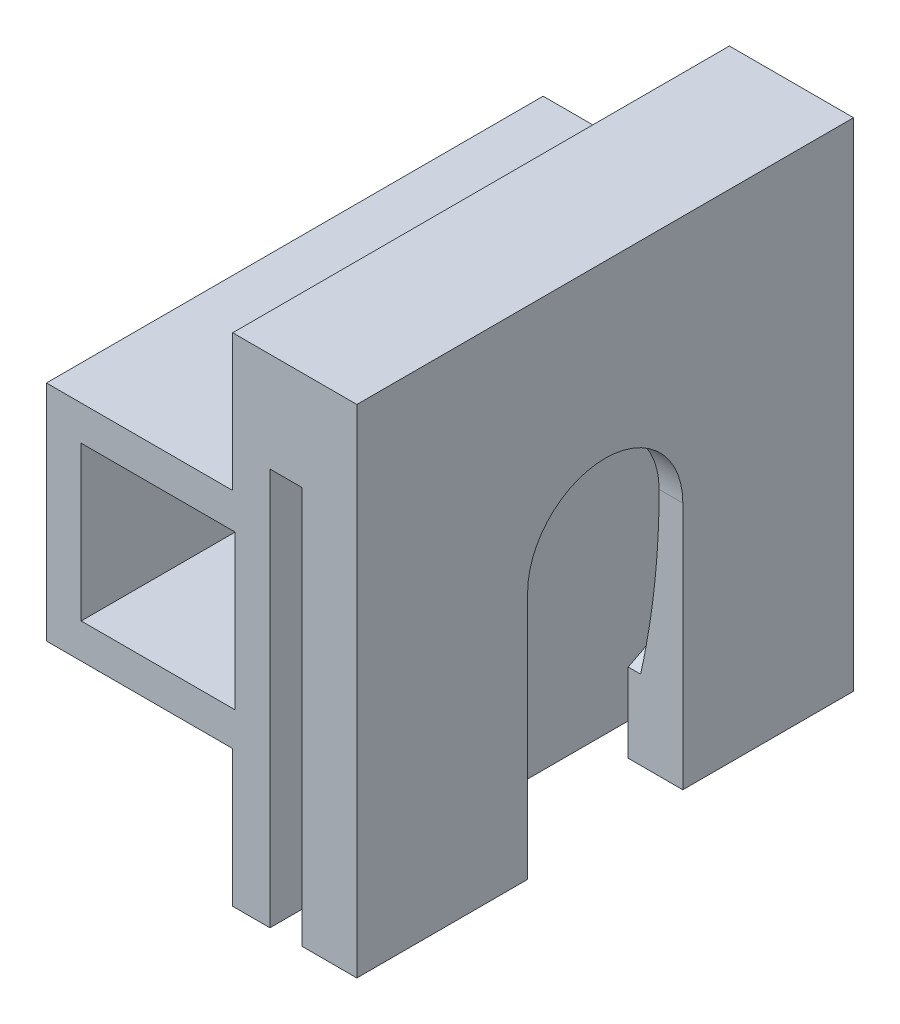
ISO-10303-21;
HEADER;
FILE_DESCRIPTION(('STEP AP214'),'2;1');
FILE_NAME('part.step','',(''),(''),'','','');
FILE_SCHEMA(('AUTOMOTIVE_DESIGN { 1 0 10303 214 1 1 1 1 }'));
ENDSEC;
DATA;
#1=APPLICATION_CONTEXT('core data for automotive mechanical design processes');
#2=APPLICATION_PROTOCOL_DEFINITION('international standard','automotive_design',2000,#1);
#3=PRODUCT_CONTEXT('',#1,'mechanical');
#4=PRODUCT('Part','Part','',(#3));
#5=PRODUCT_RELATED_PRODUCT_CATEGORY('part','',(#4));
#6=PRODUCT_DEFINITION_FORMATION('','',#4);
#7=PRODUCT_DEFINITION_CONTEXT('part definition',#1,'design');
#8=PRODUCT_DEFINITION('design','',#6,#7);
#9=PRODUCT_DEFINITION_SHAPE('','',#8);
#10=(LENGTH_UNIT() NAMED_UNIT(*) SI_UNIT(.MILLI.,.METRE.));
#11=(NAMED_UNIT(*) PLANE_ANGLE_UNIT() SI_UNIT($,.RADIAN.));
#12=(NAMED_UNIT(*) SI_UNIT($,.STERADIAN.) SOLID_ANGLE_UNIT());
#13=UNCERTAINTY_MEASURE_WITH_UNIT(LENGTH_MEASURE(1.E-05),#10,'distance_accuracy_value','');
#14=(GEOMETRIC_REPRESENTATION_CONTEXT(3) GLOBAL_UNCERTAINTY_ASSIGNED_CONTEXT((#13)) GLOBAL_UNIT_ASSIGNED_CONTEXT((#10,
#11,#12)) REPRESENTATION_CONTEXT('',''));
#15=CARTESIAN_POINT('',(0.,0.,0.));
#16=DIRECTION('',(0.,0.,1.));
#17=DIRECTION('',(1.,0.,0.));
#18=AXIS2_PLACEMENT_3D('',#15,#16,#17);
#19=CARTESIAN_POINT('',(-25.2842712474619,-10.,20.));
#20=DIRECTION('',(0.,-1.,0.));
#21=DIRECTION('',(0.,0.,-1.));
#22=AXIS2_PLACEMENT_3D('',#19,#20,#21);
#23=PLANE('',#22);
#24=DIRECTION('',(1.,0.,0.));
#25=VECTOR('',#24,1.);
#26=CARTESIAN_POINT('',(-11.1104853464801,-10.,6.875));
#27=LINE('',#26,#25);
#28=CARTESIAN_POINT('',(5.8,-10.,6.875));
#29=VERTEX_POINT('',#28);
#30=CARTESIAN_POINT('',(8.,-10.,6.875));
#31=VERTEX_POINT('',#30);
#32=EDGE_CURVE('E273',#29,#31,#27,.T.);
#33=ORIENTED_EDGE('',*,*,#32,.F.);
#34=DIRECTION('',(0.,0.,1.));
#35=VECTOR('',#34,1.);
#36=CARTESIAN_POINT('',(5.8,-10.,0.));
#37=LINE('',#36,#35);
#38=CARTESIAN_POINT('',(5.8,-10.,0.));
#39=VERTEX_POINT('',#38);
#40=EDGE_CURVE('E233',#39,#29,#37,.T.);
#41=ORIENTED_EDGE('',*,*,#40,.F.);
#42=DIRECTION('',(1.,0.,0.));
#43=VECTOR('',#42,1.);
#44=CARTESIAN_POINT('',(-25.2842712474619,-10.,0.));
#45=LINE('',#44,#43);
#46=CARTESIAN_POINT('',(8.,-10.,0.));
#47=VERTEX_POINT('',#46);
#48=EDGE_CURVE('E336',#39,#47,#45,.T.);
#49=ORIENTED_EDGE('',*,*,#48,.T.);
#50=DIRECTION('',(0.,0.,-1.));
#51=VECTOR('',#50,1.);
#52=CARTESIAN_POINT('',(8.,-10.,20.));
#53=LINE('',#52,#51);
#54=EDGE_CURVE('E304',#31,#47,#53,.T.);
#55=ORIENTED_EDGE('',*,*,#54,.F.);
#56=EDGE_LOOP('',(#33,#41,#49,#55));
#57=FACE_BOUND('',#56,.T.);
#58=ADVANCED_FACE('F33',(#57),#23,.T.);
#59=DIRECTION('',(0.,0.,-1.));
#60=VECTOR('',#59,1.);
#61=CARTESIAN_POINT('',(4.5,-10.,20.));
#62=LINE('',#61,#60);
#63=CARTESIAN_POINT('',(4.5,-10.,20.));
#64=VERTEX_POINT('',#63);
#65=CARTESIAN_POINT('',(4.50000000000001,-10.,0.));
#66=VERTEX_POINT('',#65);
#67=EDGE_CURVE('E272',#64,#66,#62,.T.);
#68=ORIENTED_EDGE('',*,*,#67,.F.);
#69=DIRECTION('',(1.,0.,0.));
#70=VECTOR('',#69,1.);
#71=CARTESIAN_POINT('',(-25.2842712474619,-10.,20.));
#72=LINE('',#71,#70);
#73=CARTESIAN_POINT('',(3.,-10.,20.));
#74=VERTEX_POINT('',#73);
#75=EDGE_CURVE('E337',#74,#64,#72,.T.);
#76=ORIENTED_EDGE('',*,*,#75,.F.);
#77=DIRECTION('',(0.,0.,1.));
#78=VECTOR('',#77,1.);
#79=CARTESIAN_POINT('',(3.,-10.,20.));
#80=LINE('',#79,#78);
#81=CARTESIAN_POINT('',(3.,-10.,0.));
#82=VERTEX_POINT('',#81);
#83=EDGE_CURVE('E328',#82,#74,#80,.T.);
#84=ORIENTED_EDGE('',*,*,#83,.F.);
#85=EDGE_CURVE('E333',#82,#66,#45,.T.);
#86=ORIENTED_EDGE('',*,*,#85,.T.);
#87=EDGE_LOOP('',(#68,#76,#84,#86));
#88=FACE_BOUND('',#87,.T.);
#89=ADVANCED_FACE('F456',(#88),#23,.T.);
#90=CARTESIAN_POINT('',(4.5,-4.5,20.));
#91=DIRECTION('',(0.,1.,0.));
#92=DIRECTION('',(0.,0.,1.));
#93=AXIS2_PLACEMENT_3D('',#90,#91,#92);
#94=PLANE('',#93);
#95=DIRECTION('',(0.,0.,-1.));
#96=VECTOR('',#95,1.);
#97=CARTESIAN_POINT('',(3.,-4.5,20.));
#98=LINE('',#97,#96);
#99=CARTESIAN_POINT('',(3.,-4.5,20.));
#100=VERTEX_POINT('',#99);
#101=CARTESIAN_POINT('',(3.,-4.5,0.));
#102=VERTEX_POINT('',#101);
#103=EDGE_CURVE('E344',#100,#102,#98,.T.);
#104=ORIENTED_EDGE('',*,*,#103,.F.);
#105=DIRECTION('',(1.,0.,0.));
#106=VECTOR('',#105,1.);
#107=CARTESIAN_POINT('',(4.5,-4.5,20.));
#108=LINE('',#107,#106);
#109=CARTESIAN_POINT('',(-4.5,-4.5,20.));
#110=VERTEX_POINT('',#109);
#111=EDGE_CURVE('E351',#110,#100,#108,.T.);
#112=ORIENTED_EDGE('',*,*,#111,.F.);
#113=DIRECTION('',(0.,0.,-1.));
#114=VECTOR('',#113,1.);
#115=CARTESIAN_POINT('',(-4.5,-4.5,20.));
#116=LINE('',#115,#114);
#117=CARTESIAN_POINT('',(-4.5,-4.5,0.));
#118=VERTEX_POINT('',#117);
#119=EDGE_CURVE('E365',#110,#118,#116,.T.);
#120=ORIENTED_EDGE('',*,*,#119,.T.);
#121=DIRECTION('',(1.,0.,0.));
#122=VECTOR('',#121,1.);
#123=CARTESIAN_POINT('',(4.5,-4.5,0.));
#124=LINE('',#123,#122);
#125=EDGE_CURVE('E360',#118,#102,#124,.T.);
#126=ORIENTED_EDGE('',*,*,#125,.T.);
#127=EDGE_LOOP('',(#104,#112,#120,#126));
#128=FACE_BOUND('',#127,.T.);
#129=ADVANCED_FACE('F458',(#128),#94,.F.);
#130=CARTESIAN_POINT('',(4.5,4.5,20.));
#131=DIRECTION('',(0.,-1.,0.));
#132=DIRECTION('',(1.,0.,0.));
#133=AXIS2_PLACEMENT_3D('',#130,#131,#132);
#134=PLANE('',#133);
#135=DIRECTION('',(0.,0.,1.));
#136=VECTOR('',#135,1.);
#137=CARTESIAN_POINT('',(3.,4.5,20.));
#138=LINE('',#137,#136);
#139=CARTESIAN_POINT('',(3.,4.5,0.));
#140=VERTEX_POINT('',#139);
#141=CARTESIAN_POINT('',(3.,4.5,20.));
#142=VERTEX_POINT('',#141);
#143=EDGE_CURVE('E341',#140,#142,#138,.T.);
#144=ORIENTED_EDGE('',*,*,#143,.F.);
#145=DIRECTION('',(-1.,0.,0.));
#146=VECTOR('',#145,1.);
#147=CARTESIAN_POINT('',(4.5,4.5,0.));
#148=LINE('',#147,#146);
#149=CARTESIAN_POINT('',(-4.5,4.5,0.));
#150=VERTEX_POINT('',#149);
#151=EDGE_CURVE('E352',#140,#150,#148,.T.);
#152=ORIENTED_EDGE('',*,*,#151,.T.);
#153=DIRECTION('',(0.,0.,-1.));
#154=VECTOR('',#153,1.);
#155=CARTESIAN_POINT('',(-4.5,4.5,20.));
#156=LINE('',#155,#154);
#157=CARTESIAN_POINT('',(-4.5,4.5,20.));
#158=VERTEX_POINT('',#157);
#159=EDGE_CURVE('E357',#158,#150,#156,.T.);
#160=ORIENTED_EDGE('',*,*,#159,.F.);
#161=DIRECTION('',(-1.,0.,0.));
#162=VECTOR('',#161,1.);
#163=CARTESIAN_POINT('',(4.5,4.5,20.));
#164=LINE('',#163,#162);
#165=EDGE_CURVE('E355',#142,#158,#164,.T.);
#166=ORIENTED_EDGE('',*,*,#165,.F.);
#167=EDGE_LOOP('',(#144,#152,#160,#166));
#168=FACE_BOUND('',#167,.T.);
#169=ADVANCED_FACE('F442',(#168),#134,.F.);
#170=CARTESIAN_POINT('',(-4.5,4.5,20.));
#171=DIRECTION('',(1.,0.,0.));
#172=DIRECTION('',(0.,0.,-1.));
#173=AXIS2_PLACEMENT_3D('',#170,#171,#172);
#174=PLANE('',#173);
#175=DIRECTION('',(0.,-1.,0.));
#176=VECTOR('',#175,1.);
#177=CARTESIAN_POINT('',(-4.5,4.5,0.));
#178=LINE('',#177,#176);
#179=EDGE_CURVE('E347',#150,#118,#178,.T.);
#180=ORIENTED_EDGE('',*,*,#179,.T.);
#181=ORIENTED_EDGE('',*,*,#119,.F.);
#182=DIRECTION('',(0.,-1.,0.));
#183=VECTOR('',#182,1.);
#184=CARTESIAN_POINT('',(-4.5,4.5,20.));
#185=LINE('',#184,#183);
#186=EDGE_CURVE('E348',#158,#110,#185,.T.);
#187=ORIENTED_EDGE('',*,*,#186,.F.);
#188=ORIENTED_EDGE('',*,*,#159,.T.);
#189=EDGE_LOOP('',(#180,#181,#187,#188));
#190=FACE_BOUND('',#189,.T.);
#191=ADVANCED_FACE('F35',(#190),#174,.F.);
#192=CARTESIAN_POINT('',(0.,0.,20.));
#193=DIRECTION('',(0.,0.,-1.));
#194=DIRECTION('',(-1.,0.,0.));
#195=AXIS2_PLACEMENT_3D('',#192,#193,#194);
#196=PLANE('',#195);
#197=DIRECTION('',(1.,0.,0.));
#198=VECTOR('',#197,1.);
#199=CARTESIAN_POINT('',(-3.1,3.1,20.));
#200=LINE('',#199,#198);
#201=CARTESIAN_POINT('',(-3.1,3.1,20.));
#202=VERTEX_POINT('',#201);
#203=CARTESIAN_POINT('',(3.1,3.1,20.));
#204=VERTEX_POINT('',#203);
#205=EDGE_CURVE('E202',#202,#204,#200,.T.);
#206=ORIENTED_EDGE('',*,*,#205,.T.);
#207=DIRECTION('',(0.,-1.,0.));
#208=VECTOR('',#207,1.);
#209=CARTESIAN_POINT('',(3.1,-3.1,20.));
#210=LINE('',#209,#208);
#211=CARTESIAN_POINT('',(3.1,-3.1,20.));
#212=VERTEX_POINT('',#211);
#213=EDGE_CURVE('E196',#204,#212,#210,.T.);
#214=ORIENTED_EDGE('',*,*,#213,.T.);
#215=DIRECTION('',(-1.,0.,0.));
#216=VECTOR('',#215,1.);
#217=CARTESIAN_POINT('',(-3.1,-3.1,20.));
#218=LINE('',#217,#216);
#219=CARTESIAN_POINT('',(-3.1,-3.1,20.));
#220=VERTEX_POINT('',#219);
#221=EDGE_CURVE('E205',#212,#220,#218,.T.);
#222=ORIENTED_EDGE('',*,*,#221,.T.);
#223=DIRECTION('',(0.,1.,0.));
#224=VECTOR('',#223,1.);
#225=CARTESIAN_POINT('',(-3.1,-3.1,20.));
#226=LINE('',#225,#224);
#227=EDGE_CURVE('E48',#220,#202,#226,.T.);
#228=ORIENTED_EDGE('',*,*,#227,.T.);
#229=EDGE_LOOP('',(#206,#214,#222,#228));
#230=FACE_BOUND('',#229,.T.);
#231=DIRECTION('',(0.,1.,0.));
#232=VECTOR('',#231,1.);
#233=CARTESIAN_POINT('',(5.8,-10.,20.));
#234=LINE('',#233,#232);
#235=CARTESIAN_POINT('',(5.8,-10.,20.));
#236=VERTEX_POINT('',#235);
#237=CARTESIAN_POINT('',(5.8,6.,20.));
#238=VERTEX_POINT('',#237);
#239=EDGE_CURVE('E254',#236,#238,#234,.T.);
#240=ORIENTED_EDGE('',*,*,#239,.F.);
#241=CARTESIAN_POINT('',(8.,-10.,20.));
#242=VERTEX_POINT('',#241);
#243=EDGE_CURVE('E317',#236,#242,#72,.T.);
#244=ORIENTED_EDGE('',*,*,#243,.T.);
#245=DIRECTION('',(0.,-1.,0.));
#246=VECTOR('',#245,1.);
#247=CARTESIAN_POINT('',(8.,10.,20.));
#248=LINE('',#247,#246);
#249=CARTESIAN_POINT('',(8.,10.,20.));
#250=VERTEX_POINT('',#249);
#251=EDGE_CURVE('E314',#250,#242,#248,.T.);
#252=ORIENTED_EDGE('',*,*,#251,.F.);
#253=DIRECTION('',(1.,0.,0.));
#254=VECTOR('',#253,1.);
#255=CARTESIAN_POINT('',(-25.2842712474619,10.,20.));
#256=LINE('',#255,#254);
#257=CARTESIAN_POINT('',(3.,10.,20.));
#258=VERTEX_POINT('',#257);
#259=EDGE_CURVE('E329',#258,#250,#256,.T.);
#260=ORIENTED_EDGE('',*,*,#259,.F.);
#261=DIRECTION('',(0.,1.,0.));
#262=VECTOR('',#261,1.);
#263=CARTESIAN_POINT('',(3.,9.99999999999999,20.));
#264=LINE('',#263,#262);
#265=EDGE_CURVE('E324',#142,#258,#264,.T.);
#266=ORIENTED_EDGE('',*,*,#265,.F.);
#267=ORIENTED_EDGE('',*,*,#165,.T.);
#268=ORIENTED_EDGE('',*,*,#186,.T.);
#269=ORIENTED_EDGE('',*,*,#111,.T.);
#270=EDGE_CURVE('E325',#74,#100,#264,.T.);
#271=ORIENTED_EDGE('',*,*,#270,.F.);
#272=ORIENTED_EDGE('',*,*,#75,.T.);
#273=DIRECTION('',(0.,-1.,0.));
#274=VECTOR('',#273,1.);
#275=CARTESIAN_POINT('',(4.5,6.,20.));
#276=LINE('',#275,#274);
#277=CARTESIAN_POINT('',(4.5,6.,20.));
#278=VERTEX_POINT('',#277);
#279=EDGE_CURVE('E290',#278,#64,#276,.T.);
#280=ORIENTED_EDGE('',*,*,#279,.F.);
#281=DIRECTION('',(-1.,0.,0.));
#282=VECTOR('',#281,1.);
#283=CARTESIAN_POINT('',(4.5,6.,20.));
#284=LINE('',#283,#282);
#285=EDGE_CURVE('E286',#238,#278,#284,.T.);
#286=ORIENTED_EDGE('',*,*,#285,.F.);
#287=EDGE_LOOP('',(#240,#244,#252,#260,#266,#267,#268,#269,#271,#272,#280,#286));
#288=FACE_BOUND('',#287,.T.);
#289=ADVANCED_FACE('F209',(#230,#288),#196,.F.);
#290=CARTESIAN_POINT('',(0.,0.,0.));
#291=DIRECTION('',(0.,0.,-1.));
#292=DIRECTION('',(-1.,0.,0.));
#293=AXIS2_PLACEMENT_3D('',#290,#291,#292);
#294=PLANE('',#293);
#295=DIRECTION('',(0.,-1.,0.));
#296=VECTOR('',#295,1.);
#297=CARTESIAN_POINT('',(3.1,-3.1,0.));
#298=LINE('',#297,#296);
#299=CARTESIAN_POINT('',(3.1,3.1,0.));
#300=VERTEX_POINT('',#299);
#301=CARTESIAN_POINT('',(3.1,-3.1,0.));
#302=VERTEX_POINT('',#301);
#303=EDGE_CURVE('E56',#300,#302,#298,.T.);
#304=ORIENTED_EDGE('',*,*,#303,.F.);
#305=DIRECTION('',(1.,0.,0.));
#306=VECTOR('',#305,1.);
#307=CARTESIAN_POINT('',(-3.1,3.1,0.));
#308=LINE('',#307,#306);
#309=CARTESIAN_POINT('',(-3.1,3.1,0.));
#310=VERTEX_POINT('',#309);
#311=EDGE_CURVE('E212',#310,#300,#308,.T.);
#312=ORIENTED_EDGE('',*,*,#311,.F.);
#313=DIRECTION('',(0.,1.,0.));
#314=VECTOR('',#313,1.);
#315=CARTESIAN_POINT('',(-3.1,-3.1,0.));
#316=LINE('',#315,#314);
#317=CARTESIAN_POINT('',(-3.1,-3.1,0.));
#318=VERTEX_POINT('',#317);
#319=EDGE_CURVE('E215',#318,#310,#316,.T.);
#320=ORIENTED_EDGE('',*,*,#319,.F.);
#321=DIRECTION('',(-1.,0.,0.));
#322=VECTOR('',#321,1.);
#323=CARTESIAN_POINT('',(-3.1,-3.1,0.));
#324=LINE('',#323,#322);
#325=EDGE_CURVE('E221',#302,#318,#324,.T.);
#326=ORIENTED_EDGE('',*,*,#325,.F.);
#327=EDGE_LOOP('',(#304,#312,#320,#326));
#328=FACE_BOUND('',#327,.T.);
#329=ORIENTED_EDGE('',*,*,#48,.F.);
#330=DIRECTION('',(0.,-1.,0.));
#331=VECTOR('',#330,1.);
#332=CARTESIAN_POINT('',(5.8,6.,0.));
#333=LINE('',#332,#331);
#334=CARTESIAN_POINT('',(5.8,6.,0.));
#335=VERTEX_POINT('',#334);
#336=EDGE_CURVE('E227',#335,#39,#333,.T.);
#337=ORIENTED_EDGE('',*,*,#336,.F.);
#338=DIRECTION('',(1.,0.,0.));
#339=VECTOR('',#338,1.);
#340=CARTESIAN_POINT('',(4.50000000000001,6.,0.));
#341=LINE('',#340,#339);
#342=CARTESIAN_POINT('',(4.50000000000001,6.,0.));
#343=VERTEX_POINT('',#342);
#344=EDGE_CURVE('E282',#343,#335,#341,.T.);
#345=ORIENTED_EDGE('',*,*,#344,.F.);
#346=DIRECTION('',(0.,-1.,0.));
#347=VECTOR('',#346,1.);
#348=CARTESIAN_POINT('',(4.50000000000001,6.,0.));
#349=LINE('',#348,#347);
#350=EDGE_CURVE('E288',#343,#66,#349,.T.);
#351=ORIENTED_EDGE('',*,*,#350,.T.);
#352=ORIENTED_EDGE('',*,*,#85,.F.);
#353=DIRECTION('',(0.,-1.,0.));
#354=VECTOR('',#353,1.);
#355=CARTESIAN_POINT('',(3.,9.99999999999999,0.));
#356=LINE('',#355,#354);
#357=EDGE_CURVE('E322',#102,#82,#356,.T.);
#358=ORIENTED_EDGE('',*,*,#357,.F.);
#359=ORIENTED_EDGE('',*,*,#125,.F.);
#360=ORIENTED_EDGE('',*,*,#179,.F.);
#361=ORIENTED_EDGE('',*,*,#151,.F.);
#362=CARTESIAN_POINT('',(3.,10.,0.));
#363=VERTEX_POINT('',#362);
#364=EDGE_CURVE('E318',#363,#140,#356,.T.);
#365=ORIENTED_EDGE('',*,*,#364,.F.);
#366=DIRECTION('',(1.,0.,0.));
#367=VECTOR('',#366,1.);
#368=CARTESIAN_POINT('',(-25.2842712474619,10.,0.));
#369=LINE('',#368,#367);
#370=CARTESIAN_POINT('',(8.,10.,0.));
#371=VERTEX_POINT('',#370);
#372=EDGE_CURVE('E331',#363,#371,#369,.T.);
#373=ORIENTED_EDGE('',*,*,#372,.T.);
#374=DIRECTION('',(0.,1.,0.));
#375=VECTOR('',#374,1.);
#376=CARTESIAN_POINT('',(8.,-10.,0.));
#377=LINE('',#376,#375);
#378=EDGE_CURVE('E308',#47,#371,#377,.T.);
#379=ORIENTED_EDGE('',*,*,#378,.F.);
#380=EDGE_LOOP('',(#329,#337,#345,#351,#352,#358,#359,#360,#361,#365,#373,#379));
#381=FACE_BOUND('',#380,.T.);
#382=ADVANCED_FACE('F429',(#328,#381),#294,.T.);
#383=CARTESIAN_POINT('',(-25.2842712474619,10.,20.));
#384=DIRECTION('',(0.,1.,0.));
#385=DIRECTION('',(0.,0.,1.));
#386=AXIS2_PLACEMENT_3D('',#383,#384,#385);
#387=PLANE('',#386);
#388=DIRECTION('',(0.,0.,-1.));
#389=VECTOR('',#388,1.);
#390=CARTESIAN_POINT('',(3.,10.,20.));
#391=LINE('',#390,#389);
#392=EDGE_CURVE('E321',#258,#363,#391,.T.);
#393=ORIENTED_EDGE('',*,*,#392,.F.);
#394=ORIENTED_EDGE('',*,*,#259,.T.);
#395=DIRECTION('',(0.,0.,1.));
#396=VECTOR('',#395,1.);
#397=CARTESIAN_POINT('',(8.,10.,0.));
#398=LINE('',#397,#396);
#399=EDGE_CURVE('E311',#371,#250,#398,.T.);
#400=ORIENTED_EDGE('',*,*,#399,.F.);
#401=ORIENTED_EDGE('',*,*,#372,.F.);
#402=EDGE_LOOP('',(#393,#394,#400,#401));
#403=FACE_BOUND('',#402,.T.);
#404=ADVANCED_FACE('F435',(#403),#387,.T.);
#405=CARTESIAN_POINT('',(3.,3.,20.));
#406=DIRECTION('',(1.,0.,0.));
#407=DIRECTION('',(0.,1.,0.));
#408=AXIS2_PLACEMENT_3D('',#405,#406,#407);
#409=PLANE('',#408);
#410=ORIENTED_EDGE('',*,*,#364,.T.);
#411=ORIENTED_EDGE('',*,*,#143,.T.);
#412=ORIENTED_EDGE('',*,*,#265,.T.);
#413=ORIENTED_EDGE('',*,*,#392,.T.);
#414=EDGE_LOOP('',(#410,#411,#412,#413));
#415=FACE_BOUND('',#414,.T.);
#416=ADVANCED_FACE('F440',(#415),#409,.F.);
#417=ORIENTED_EDGE('',*,*,#270,.T.);
#418=ORIENTED_EDGE('',*,*,#103,.T.);
#419=ORIENTED_EDGE('',*,*,#357,.T.);
#420=ORIENTED_EDGE('',*,*,#83,.T.);
#421=EDGE_LOOP('',(#417,#418,#419,#420));
#422=FACE_BOUND('',#421,.T.);
#423=ADVANCED_FACE('F452',(#422),#409,.F.);
#424=DIRECTION('',(1.,0.,0.));
#425=VECTOR('',#424,1.);
#426=CARTESIAN_POINT('',(-11.1104853464801,-10.,13.125));
#427=LINE('',#426,#425);
#428=CARTESIAN_POINT('',(5.8,-10.,13.125));
#429=VERTEX_POINT('',#428);
#430=CARTESIAN_POINT('',(8.,-10.,13.125));
#431=VERTEX_POINT('',#430);
#432=EDGE_CURVE('E275',#429,#431,#427,.T.);
#433=ORIENTED_EDGE('',*,*,#432,.T.);
#434=EDGE_CURVE('E305',#242,#431,#53,.T.);
#435=ORIENTED_EDGE('',*,*,#434,.F.);
#436=ORIENTED_EDGE('',*,*,#243,.F.);
#437=DIRECTION('',(0.,0.,1.));
#438=VECTOR('',#437,1.);
#439=CARTESIAN_POINT('',(5.8,-10.,13.125));
#440=LINE('',#439,#438);
#441=EDGE_CURVE('E251',#429,#236,#440,.T.);
#442=ORIENTED_EDGE('',*,*,#441,.F.);
#443=EDGE_LOOP('',(#433,#435,#436,#442));
#444=FACE_BOUND('',#443,.T.);
#445=ADVANCED_FACE('F407',(#444),#23,.T.);
#446=CARTESIAN_POINT('',(8.,0.,0.));
#447=DIRECTION('',(1.,0.,0.));
#448=DIRECTION('',(0.,0.,-1.));
#449=AXIS2_PLACEMENT_3D('',#446,#447,#448);
#450=PLANE('',#449);
#451=DIRECTION('',(0.,1.,0.));
#452=VECTOR('',#451,1.);
#453=CARTESIAN_POINT('',(8.,0.,6.875));
#454=LINE('',#453,#452);
#455=CARTESIAN_POINT('',(8.,0.,6.875));
#456=VERTEX_POINT('',#455);
#457=EDGE_CURVE('E266',#31,#456,#454,.T.);
#458=ORIENTED_EDGE('',*,*,#457,.F.);
#459=ORIENTED_EDGE('',*,*,#54,.T.);
#460=ORIENTED_EDGE('',*,*,#378,.T.);
#461=ORIENTED_EDGE('',*,*,#399,.T.);
#462=ORIENTED_EDGE('',*,*,#251,.T.);
#463=ORIENTED_EDGE('',*,*,#434,.T.);
#464=DIRECTION('',(0.,-1.,0.));
#465=VECTOR('',#464,1.);
#466=CARTESIAN_POINT('',(8.,0.,13.125));
#467=LINE('',#466,#465);
#468=CARTESIAN_POINT('',(8.,0.,13.125));
#469=VERTEX_POINT('',#468);
#470=EDGE_CURVE('E264',#469,#431,#467,.T.);
#471=ORIENTED_EDGE('',*,*,#470,.F.);
#472=CARTESIAN_POINT('',(8.,0.,10.));
#473=DIRECTION('',(1.,0.,0.));
#474=DIRECTION('',(0.,0.,-1.));
#475=AXIS2_PLACEMENT_3D('',#472,#473,#474);
#476=CIRCLE('',#475,3.125);
#477=EDGE_CURVE('E261',#456,#469,#476,.T.);
#478=ORIENTED_EDGE('',*,*,#477,.F.);
#479=EDGE_LOOP('',(#458,#459,#460,#461,#462,#463,#471,#478));
#480=FACE_BOUND('',#479,.T.);
#481=ADVANCED_FACE('F399',(#480),#450,.T.);
#482=CARTESIAN_POINT('',(0.,6.,0.));
#483=DIRECTION('',(0.,-1.,0.));
#484=DIRECTION('',(0.,0.,-1.));
#485=AXIS2_PLACEMENT_3D('',#482,#483,#484);
#486=PLANE('',#485);
#487=DIRECTION('',(0.,0.,-1.));
#488=VECTOR('',#487,1.);
#489=CARTESIAN_POINT('',(5.8,6.,5.50000000000004));
#490=LINE('',#489,#488);
#491=CARTESIAN_POINT('',(5.8,6.,5.50000000000004));
#492=VERTEX_POINT('',#491);
#493=EDGE_CURVE('E240',#492,#335,#490,.T.);
#494=ORIENTED_EDGE('',*,*,#493,.F.);
#495=DIRECTION('',(1.,0.,0.));
#496=VECTOR('',#495,1.);
#497=CARTESIAN_POINT('',(88.99,6.,5.50000000000001));
#498=LINE('',#497,#496);
#499=CARTESIAN_POINT('',(4.50000000000001,6.,5.50000000000001));
#500=VERTEX_POINT('',#499);
#501=EDGE_CURVE('E296',#500,#492,#498,.T.);
#502=ORIENTED_EDGE('',*,*,#501,.F.);
#503=DIRECTION('',(0.,0.,-1.));
#504=VECTOR('',#503,1.);
#505=CARTESIAN_POINT('',(4.5,6.,20.));
#506=LINE('',#505,#504);
#507=EDGE_CURVE('E283',#500,#343,#506,.T.);
#508=ORIENTED_EDGE('',*,*,#507,.T.);
#509=ORIENTED_EDGE('',*,*,#344,.T.);
#510=EDGE_LOOP('',(#494,#502,#508,#509));
#511=FACE_BOUND('',#510,.T.);
#512=ADVANCED_FACE('F426',(#511),#486,.T.);
#513=DIRECTION('',(0.,0.,-1.));
#514=VECTOR('',#513,1.);
#515=CARTESIAN_POINT('',(5.8,6.,20.));
#516=LINE('',#515,#514);
#517=CARTESIAN_POINT('',(5.8,6.,14.5));
#518=VERTEX_POINT('',#517);
#519=EDGE_CURVE('E256',#238,#518,#516,.T.);
#520=ORIENTED_EDGE('',*,*,#519,.F.);
#521=ORIENTED_EDGE('',*,*,#285,.T.);
#522=CARTESIAN_POINT('',(4.5,6.,14.5));
#523=VERTEX_POINT('',#522);
#524=EDGE_CURVE('E279',#278,#523,#506,.T.);
#525=ORIENTED_EDGE('',*,*,#524,.T.);
#526=DIRECTION('',(1.,0.,0.));
#527=VECTOR('',#526,1.);
#528=CARTESIAN_POINT('',(88.99,6.,14.5));
#529=LINE('',#528,#527);
#530=EDGE_CURVE('E292',#518,#523,#529,.F.);
#531=ORIENTED_EDGE('',*,*,#530,.F.);
#532=EDGE_LOOP('',(#520,#521,#525,#531));
#533=FACE_BOUND('',#532,.T.);
#534=ADVANCED_FACE('F417',(#533),#486,.T.);
#535=CARTESIAN_POINT('',(88.99,0.,10.));
#536=DIRECTION('',(1.,0.,0.));
#537=DIRECTION('',(0.,0.,-1.));
#538=AXIS2_PLACEMENT_3D('',#535,#536,#537);
#539=CYLINDRICAL_SURFACE('',#538,7.5);
#540=CARTESIAN_POINT('',(4.5,0.,10.));
#541=DIRECTION('',(1.,0.,0.));
#542=DIRECTION('',(0.,0.,-1.));
#543=AXIS2_PLACEMENT_3D('',#540,#541,#542);
#544=CIRCLE('',#543,7.49999999999999);
#545=EDGE_CURVE('E299',#500,#523,#544,.T.);
#546=ORIENTED_EDGE('',*,*,#545,.F.);
#547=ORIENTED_EDGE('',*,*,#501,.T.);
#548=CARTESIAN_POINT('',(5.8,0.,10.));
#549=DIRECTION('',(1.,0.,0.));
#550=DIRECTION('',(0.,0.,1.));
#551=AXIS2_PLACEMENT_3D('',#548,#549,#550);
#552=CIRCLE('',#551,7.49999999999997);
#553=CARTESIAN_POINT('',(5.8,-6.81794507164729,6.875));
#554=VERTEX_POINT('',#553);
#555=EDGE_CURVE('E238',#554,#492,#552,.T.);
#556=ORIENTED_EDGE('',*,*,#555,.F.);
#557=DIRECTION('',(1.,0.,0.));
#558=VECTOR('',#557,1.);
#559=CARTESIAN_POINT('',(5.8,-6.81794507164729,6.875));
#560=LINE('',#559,#558);
#561=CARTESIAN_POINT('',(6.3,-6.81794507164729,6.875));
#562=VERTEX_POINT('',#561);
#563=EDGE_CURVE('E242',#554,#562,#560,.T.);
#564=ORIENTED_EDGE('',*,*,#563,.T.);
#565=CARTESIAN_POINT('',(6.3,0.,10.));
#566=DIRECTION('',(1.,0.,0.));
#567=DIRECTION('',(0.,0.,-1.));
#568=AXIS2_PLACEMENT_3D('',#565,#566,#567);
#569=CIRCLE('',#568,7.5);
#570=CARTESIAN_POINT('',(6.3,-6.81794507164732,13.125));
#571=VERTEX_POINT('',#570);
#572=EDGE_CURVE('E302',#562,#571,#569,.T.);
#573=ORIENTED_EDGE('',*,*,#572,.T.);
#574=DIRECTION('',(1.,0.,0.));
#575=VECTOR('',#574,1.);
#576=CARTESIAN_POINT('',(5.8,-6.81794507164732,13.125));
#577=LINE('',#576,#575);
#578=CARTESIAN_POINT('',(5.8,-6.81794507164732,13.125));
#579=VERTEX_POINT('',#578);
#580=EDGE_CURVE('E258',#579,#571,#577,.T.);
#581=ORIENTED_EDGE('',*,*,#580,.F.);
#582=CARTESIAN_POINT('',(5.8,0.,10.));
#583=DIRECTION('',(1.,0.,0.));
#584=DIRECTION('',(0.,0.,1.));
#585=AXIS2_PLACEMENT_3D('',#582,#583,#584);
#586=CIRCLE('',#585,7.5);
#587=EDGE_CURVE('E245',#518,#579,#586,.T.);
#588=ORIENTED_EDGE('',*,*,#587,.F.);
#589=ORIENTED_EDGE('',*,*,#530,.T.);
#590=EDGE_LOOP('',(#546,#547,#556,#564,#573,#581,#588,#589));
#591=FACE_BOUND('',#590,.T.);
#592=ADVANCED_FACE('F387',(#591),#539,.F.);
#593=CARTESIAN_POINT('',(-24.49,0.,10.));
#594=DIRECTION('',(1.,0.,0.));
#595=DIRECTION('',(0.,1.,0.));
#596=AXIS2_PLACEMENT_3D('',#593,#594,#595);
#597=SPHERICAL_SURFACE('',#596,31.6902839999896);
#598=CARTESIAN_POINT('',(-24.49,0.,6.875));
#599=DIRECTION('',(0.,0.,-1.));
#600=DIRECTION('',(-1.,0.,0.));
#601=AXIS2_PLACEMENT_3D('',#598,#599,#600);
#602=CIRCLE('',#601,31.5358284337038);
#603=CARTESIAN_POINT('',(7.04582843370379,0.,6.875));
#604=VERTEX_POINT('',#603);
#605=EDGE_CURVE('E11',#604,#562,#602,.T.);
#606=ORIENTED_EDGE('',*,*,#605,.F.);
#607=CARTESIAN_POINT('',(7.04582843370379,0.,10.));
#608=DIRECTION('',(-1.,0.,0.));
#609=DIRECTION('',(0.,0.,1.));
#610=AXIS2_PLACEMENT_3D('',#607,#608,#609);
#611=CIRCLE('',#610,3.125);
#612=CARTESIAN_POINT('',(7.04582843370379,0.,13.125));
#613=VERTEX_POINT('',#612);
#614=EDGE_CURVE('E41',#613,#604,#611,.T.);
#615=ORIENTED_EDGE('',*,*,#614,.F.);
#616=CARTESIAN_POINT('',(-24.49,0.,13.125));
#617=DIRECTION('',(0.,0.,1.));
#618=DIRECTION('',(0.,-1.,0.));
#619=AXIS2_PLACEMENT_3D('',#616,#617,#618);
#620=CIRCLE('',#619,31.5358284337038);
#621=EDGE_CURVE('E368',#571,#613,#620,.T.);
#622=ORIENTED_EDGE('',*,*,#621,.F.);
#623=ORIENTED_EDGE('',*,*,#572,.F.);
#624=EDGE_LOOP('',(#606,#615,#622,#623));
#625=FACE_BOUND('',#624,.T.);
#626=ADVANCED_FACE('F382',(#625),#597,.F.);
#627=CARTESIAN_POINT('',(4.50000000000001,7.49999999999999,10.));
#628=DIRECTION('',(1.,0.,0.));
#629=DIRECTION('',(0.,0.,-1.));
#630=AXIS2_PLACEMENT_3D('',#627,#628,#629);
#631=PLANE('',#630);
#632=ORIENTED_EDGE('',*,*,#545,.T.);
#633=ORIENTED_EDGE('',*,*,#524,.F.);
#634=ORIENTED_EDGE('',*,*,#279,.T.);
#635=ORIENTED_EDGE('',*,*,#67,.T.);
#636=ORIENTED_EDGE('',*,*,#350,.F.);
#637=ORIENTED_EDGE('',*,*,#507,.F.);
#638=EDGE_LOOP('',(#632,#633,#634,#635,#636,#637));
#639=FACE_BOUND('',#638,.T.);
#640=ADVANCED_FACE('F420',(#639),#631,.T.);
#641=CARTESIAN_POINT('',(-11.1104853464801,0.,10.));
#642=DIRECTION('',(1.,0.,0.));
#643=DIRECTION('',(0.,0.,-1.));
#644=AXIS2_PLACEMENT_3D('',#641,#642,#643);
#645=CYLINDRICAL_SURFACE('',#644,3.125);
#646=ORIENTED_EDGE('',*,*,#614,.T.);
#647=DIRECTION('',(1.,0.,0.));
#648=VECTOR('',#647,1.);
#649=CARTESIAN_POINT('',(-11.1104853464801,0.,6.875));
#650=LINE('',#649,#648);
#651=EDGE_CURVE('E270',#604,#456,#650,.T.);
#652=ORIENTED_EDGE('',*,*,#651,.T.);
#653=ORIENTED_EDGE('',*,*,#477,.T.);
#654=DIRECTION('',(1.,0.,0.));
#655=VECTOR('',#654,1.);
#656=CARTESIAN_POINT('',(-11.1104853464801,0.,13.125));
#657=LINE('',#656,#655);
#658=EDGE_CURVE('E269',#613,#469,#657,.T.);
#659=ORIENTED_EDGE('',*,*,#658,.F.);
#660=EDGE_LOOP('',(#646,#652,#653,#659));
#661=FACE_BOUND('',#660,.T.);
#662=ADVANCED_FACE('F373',(#661),#645,.F.);
#663=CARTESIAN_POINT('',(-11.1104853464801,0.,6.875));
#664=DIRECTION('',(0.,0.,-1.));
#665=DIRECTION('',(-1.,0.,0.));
#666=AXIS2_PLACEMENT_3D('',#663,#664,#665);
#667=PLANE('',#666);
#668=ORIENTED_EDGE('',*,*,#605,.T.);
#669=ORIENTED_EDGE('',*,*,#563,.F.);
#670=DIRECTION('',(0.,1.,0.));
#671=VECTOR('',#670,1.);
#672=CARTESIAN_POINT('',(5.8,-10.,6.875));
#673=LINE('',#672,#671);
#674=EDGE_CURVE('E236',#29,#554,#673,.T.);
#675=ORIENTED_EDGE('',*,*,#674,.F.);
#676=ORIENTED_EDGE('',*,*,#32,.T.);
#677=ORIENTED_EDGE('',*,*,#457,.T.);
#678=ORIENTED_EDGE('',*,*,#651,.F.);
#679=EDGE_LOOP('',(#668,#669,#675,#676,#677,#678));
#680=FACE_BOUND('',#679,.T.);
#681=ADVANCED_FACE('F378',(#680),#667,.F.);
#682=CARTESIAN_POINT('',(-11.1104853464801,0.,13.125));
#683=DIRECTION('',(0.,0.,1.));
#684=DIRECTION('',(0.,-1.,0.));
#685=AXIS2_PLACEMENT_3D('',#682,#683,#684);
#686=PLANE('',#685);
#687=ORIENTED_EDGE('',*,*,#621,.T.);
#688=ORIENTED_EDGE('',*,*,#658,.T.);
#689=ORIENTED_EDGE('',*,*,#470,.T.);
#690=ORIENTED_EDGE('',*,*,#432,.F.);
#691=DIRECTION('',(0.,-1.,0.));
#692=VECTOR('',#691,1.);
#693=CARTESIAN_POINT('',(5.8,-6.81794507164732,13.125));
#694=LINE('',#693,#692);
#695=EDGE_CURVE('E248',#579,#429,#694,.T.);
#696=ORIENTED_EDGE('',*,*,#695,.F.);
#697=ORIENTED_EDGE('',*,*,#580,.T.);
#698=EDGE_LOOP('',(#687,#688,#689,#690,#696,#697));
#699=FACE_BOUND('',#698,.T.);
#700=ADVANCED_FACE('F404',(#699),#686,.F.);
#701=CARTESIAN_POINT('',(5.8,0.,10.));
#702=DIRECTION('',(-1.,0.,0.));
#703=DIRECTION('',(0.,0.,1.));
#704=AXIS2_PLACEMENT_3D('',#701,#702,#703);
#705=PLANE('',#704);
#706=ORIENTED_EDGE('',*,*,#587,.T.);
#707=ORIENTED_EDGE('',*,*,#695,.T.);
#708=ORIENTED_EDGE('',*,*,#441,.T.);
#709=ORIENTED_EDGE('',*,*,#239,.T.);
#710=ORIENTED_EDGE('',*,*,#519,.T.);
#711=EDGE_LOOP('',(#706,#707,#708,#709,#710));
#712=FACE_BOUND('',#711,.T.);
#713=ADVANCED_FACE('F410',(#712),#705,.T.);
#714=CARTESIAN_POINT('',(5.8,0.,10.));
#715=DIRECTION('',(-1.,0.,0.));
#716=DIRECTION('',(0.,0.,1.));
#717=AXIS2_PLACEMENT_3D('',#714,#715,#716);
#718=PLANE('',#717);
#719=ORIENTED_EDGE('',*,*,#336,.T.);
#720=ORIENTED_EDGE('',*,*,#40,.T.);
#721=ORIENTED_EDGE('',*,*,#674,.T.);
#722=ORIENTED_EDGE('',*,*,#555,.T.);
#723=ORIENTED_EDGE('',*,*,#493,.T.);
#724=EDGE_LOOP('',(#719,#720,#721,#722,#723));
#725=FACE_BOUND('',#724,.T.);
#726=ADVANCED_FACE('F390',(#725),#718,.T.);
#727=CARTESIAN_POINT('',(3.1,-3.1,20.));
#728=DIRECTION('',(1.,0.,0.));
#729=DIRECTION('',(0.,0.,-1.));
#730=AXIS2_PLACEMENT_3D('',#727,#728,#729);
#731=PLANE('',#730);
#732=ORIENTED_EDGE('',*,*,#303,.T.);
#733=DIRECTION('',(0.,0.,-1.));
#734=VECTOR('',#733,1.);
#735=CARTESIAN_POINT('',(3.1,-3.1,20.));
#736=LINE('',#735,#734);
#737=EDGE_CURVE('E192',#212,#302,#736,.T.);
#738=ORIENTED_EDGE('',*,*,#737,.F.);
#739=ORIENTED_EDGE('',*,*,#213,.F.);
#740=DIRECTION('',(0.,0.,-1.));
#741=VECTOR('',#740,1.);
#742=CARTESIAN_POINT('',(3.1,3.1,20.));
#743=LINE('',#742,#741);
#744=EDGE_CURVE('E225',#204,#300,#743,.T.);
#745=ORIENTED_EDGE('',*,*,#744,.T.);
#746=EDGE_LOOP('',(#732,#738,#739,#745));
#747=FACE_BOUND('',#746,.T.);
#748=ADVANCED_FACE('F194',(#747),#731,.F.);
#749=CARTESIAN_POINT('',(-3.1,3.1,20.));
#750=DIRECTION('',(0.,1.,0.));
#751=DIRECTION('',(0.,0.,1.));
#752=AXIS2_PLACEMENT_3D('',#749,#750,#751);
#753=PLANE('',#752);
#754=ORIENTED_EDGE('',*,*,#311,.T.);
#755=ORIENTED_EDGE('',*,*,#744,.F.);
#756=ORIENTED_EDGE('',*,*,#205,.F.);
#757=DIRECTION('',(0.,0.,-1.));
#758=VECTOR('',#757,1.);
#759=CARTESIAN_POINT('',(-3.1,3.1,20.));
#760=LINE('',#759,#758);
#761=EDGE_CURVE('E228',#202,#310,#760,.T.);
#762=ORIENTED_EDGE('',*,*,#761,.T.);
#763=EDGE_LOOP('',(#754,#755,#756,#762));
#764=FACE_BOUND('',#763,.T.);
#765=ADVANCED_FACE('F520',(#764),#753,.F.);
#766=CARTESIAN_POINT('',(-3.1,-3.1,20.));
#767=DIRECTION('',(-1.,0.,0.));
#768=DIRECTION('',(0.,0.,1.));
#769=AXIS2_PLACEMENT_3D('',#766,#767,#768);
#770=PLANE('',#769);
#771=ORIENTED_EDGE('',*,*,#319,.T.);
#772=ORIENTED_EDGE('',*,*,#761,.F.);
#773=ORIENTED_EDGE('',*,*,#227,.F.);
#774=DIRECTION('',(0.,0.,-1.));
#775=VECTOR('',#774,1.);
#776=CARTESIAN_POINT('',(-3.1,-3.1,20.));
#777=LINE('',#776,#775);
#778=EDGE_CURVE('E201',#220,#318,#777,.T.);
#779=ORIENTED_EDGE('',*,*,#778,.T.);
#780=EDGE_LOOP('',(#771,#772,#773,#779));
#781=FACE_BOUND('',#780,.T.);
#782=ADVANCED_FACE('F529',(#781),#770,.F.);
#783=CARTESIAN_POINT('',(-3.1,-3.1,20.));
#784=DIRECTION('',(0.,-1.,0.));
#785=DIRECTION('',(0.,0.,-1.));
#786=AXIS2_PLACEMENT_3D('',#783,#784,#785);
#787=PLANE('',#786);
#788=ORIENTED_EDGE('',*,*,#325,.T.);
#789=ORIENTED_EDGE('',*,*,#778,.F.);
#790=ORIENTED_EDGE('',*,*,#221,.F.);
#791=ORIENTED_EDGE('',*,*,#737,.T.);
#792=EDGE_LOOP('',(#788,#789,#790,#791));
#793=FACE_BOUND('',#792,.T.);
#794=ADVANCED_FACE('F206',(#793),#787,.F.);
#795=CLOSED_SHELL('',(#58,#89,#129,#169,#191,#289,#382,#404,#416,#423,#445,#481,#512,#534,#592,
#626,#640,#662,#681,#700,#713,#726,#748,#765,#782,#794));
#796=MANIFOLD_SOLID_BREP('B2',#795);
#797=ADVANCED_BREP_SHAPE_REPRESENTATION('',(#18,#796),#14);
#798=SHAPE_DEFINITION_REPRESENTATION(#9,#797);
ENDSEC;
END-ISO-10303-21;
